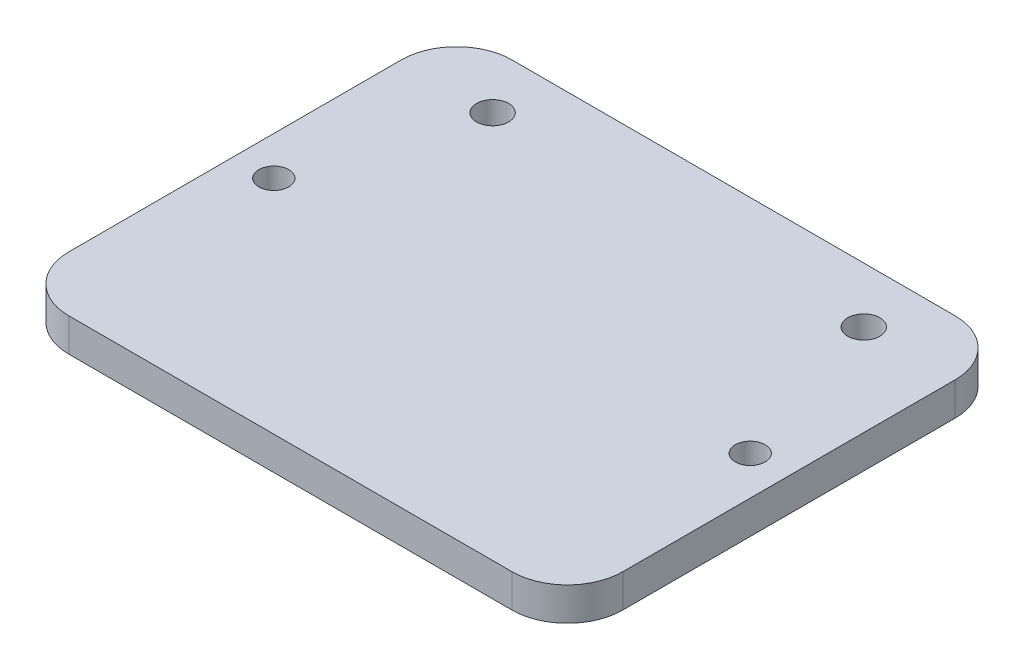
ISO-10303-21;
HEADER;
FILE_DESCRIPTION(('STEP AP214'),'2;1');
FILE_NAME('part.step','',(''),(''),'','','');
FILE_SCHEMA(('AUTOMOTIVE_DESIGN { 1 0 10303 214 1 1 1 1 }'));
ENDSEC;
DATA;
#1=APPLICATION_CONTEXT('core data for automotive mechanical design processes');
#2=APPLICATION_PROTOCOL_DEFINITION('international standard','automotive_design',2000,#1);
#3=PRODUCT_CONTEXT('',#1,'mechanical');
#4=PRODUCT('Part','Part','',(#3));
#5=PRODUCT_RELATED_PRODUCT_CATEGORY('part','',(#4));
#6=PRODUCT_DEFINITION_FORMATION('','',#4);
#7=PRODUCT_DEFINITION_CONTEXT('part definition',#1,'design');
#8=PRODUCT_DEFINITION('design','',#6,#7);
#9=PRODUCT_DEFINITION_SHAPE('','',#8);
#10=(LENGTH_UNIT() NAMED_UNIT(*) SI_UNIT(.MILLI.,.METRE.));
#11=(NAMED_UNIT(*) PLANE_ANGLE_UNIT() SI_UNIT($,.RADIAN.));
#12=(NAMED_UNIT(*) SI_UNIT($,.STERADIAN.) SOLID_ANGLE_UNIT());
#13=UNCERTAINTY_MEASURE_WITH_UNIT(LENGTH_MEASURE(1.E-05),#10,'distance_accuracy_value','');
#14=(GEOMETRIC_REPRESENTATION_CONTEXT(3) GLOBAL_UNCERTAINTY_ASSIGNED_CONTEXT((#13)) GLOBAL_UNIT_ASSIGNED_CONTEXT((#10,
#11,#12)) REPRESENTATION_CONTEXT('',''));
#15=CARTESIAN_POINT('',(0.,0.,0.));
#16=DIRECTION('',(0.,0.,1.));
#17=DIRECTION('',(1.,0.,0.));
#18=AXIS2_PLACEMENT_3D('',#15,#16,#17);
#19=CARTESIAN_POINT('',(0.,3.,-40.));
#20=DIRECTION('',(1.,0.,0.));
#21=DIRECTION('',(0.,0.,-1.));
#22=AXIS2_PLACEMENT_3D('',#19,#20,#21);
#23=PLANE('',#22);
#24=DIRECTION('',(0.,0.,1.));
#25=VECTOR('',#24,1.);
#26=CARTESIAN_POINT('',(0.,0.,-40.));
#27=LINE('',#26,#25);
#28=CARTESIAN_POINT('',(0.,0.,-35.));
#29=VERTEX_POINT('',#28);
#30=CARTESIAN_POINT('',(0.,0.,-5.));
#31=VERTEX_POINT('',#30);
#32=EDGE_CURVE('E131',#29,#31,#27,.T.);
#33=ORIENTED_EDGE('',*,*,#32,.T.);
#34=DIRECTION('',(0.,-1.,0.));
#35=VECTOR('',#34,1.);
#36=CARTESIAN_POINT('',(0.,3.,-5.));
#37=LINE('',#36,#35);
#38=CARTESIAN_POINT('',(0.,3.,-5.));
#39=VERTEX_POINT('',#38);
#40=EDGE_CURVE('E108',#31,#39,#37,.F.);
#41=ORIENTED_EDGE('',*,*,#40,.T.);
#42=DIRECTION('',(0.,0.,1.));
#43=VECTOR('',#42,1.);
#44=CARTESIAN_POINT('',(0.,3.,-40.));
#45=LINE('',#44,#43);
#46=CARTESIAN_POINT('',(0.,3.,-35.));
#47=VERTEX_POINT('',#46);
#48=EDGE_CURVE('E141',#47,#39,#45,.T.);
#49=ORIENTED_EDGE('',*,*,#48,.F.);
#50=DIRECTION('',(0.,-1.,0.));
#51=VECTOR('',#50,1.);
#52=CARTESIAN_POINT('',(0.,3.,-35.));
#53=LINE('',#52,#51);
#54=EDGE_CURVE('E113',#47,#29,#53,.T.);
#55=ORIENTED_EDGE('',*,*,#54,.T.);
#56=EDGE_LOOP('',(#33,#41,#49,#55));
#57=FACE_BOUND('',#56,.T.);
#58=ADVANCED_FACE('F37',(#57),#23,.F.);
#59=CARTESIAN_POINT('',(0.,3.,0.));
#60=DIRECTION('',(0.,0.,-1.));
#61=DIRECTION('',(-1.,0.,0.));
#62=AXIS2_PLACEMENT_3D('',#59,#60,#61);
#63=PLANE('',#62);
#64=DIRECTION('',(1.,0.,0.));
#65=VECTOR('',#64,1.);
#66=CARTESIAN_POINT('',(0.,3.,0.));
#67=LINE('',#66,#65);
#68=CARTESIAN_POINT('',(5.,3.,0.));
#69=VERTEX_POINT('',#68);
#70=CARTESIAN_POINT('',(45.,3.,0.));
#71=VERTEX_POINT('',#70);
#72=EDGE_CURVE('E123',#69,#71,#67,.T.);
#73=ORIENTED_EDGE('',*,*,#72,.F.);
#74=DIRECTION('',(0.,-1.,0.));
#75=VECTOR('',#74,1.);
#76=CARTESIAN_POINT('',(5.,3.,0.));
#77=LINE('',#76,#75);
#78=CARTESIAN_POINT('',(5.,0.,0.));
#79=VERTEX_POINT('',#78);
#80=EDGE_CURVE('E107',#69,#79,#77,.T.);
#81=ORIENTED_EDGE('',*,*,#80,.T.);
#82=DIRECTION('',(1.,0.,0.));
#83=VECTOR('',#82,1.);
#84=CARTESIAN_POINT('',(0.,0.,0.));
#85=LINE('',#84,#83);
#86=CARTESIAN_POINT('',(45.,0.,0.));
#87=VERTEX_POINT('',#86);
#88=EDGE_CURVE('E120',#79,#87,#85,.T.);
#89=ORIENTED_EDGE('',*,*,#88,.T.);
#90=DIRECTION('',(0.,-1.,0.));
#91=VECTOR('',#90,1.);
#92=CARTESIAN_POINT('',(45.,3.,0.));
#93=LINE('',#92,#91);
#94=EDGE_CURVE('E125',#87,#71,#93,.F.);
#95=ORIENTED_EDGE('',*,*,#94,.T.);
#96=EDGE_LOOP('',(#73,#81,#89,#95));
#97=FACE_BOUND('',#96,.T.);
#98=ADVANCED_FACE('F119',(#97),#63,.F.);
#99=CARTESIAN_POINT('',(50.,3.,-40.));
#100=DIRECTION('',(-1.,0.,0.));
#101=DIRECTION('',(0.,0.,1.));
#102=AXIS2_PLACEMENT_3D('',#99,#100,#101);
#103=PLANE('',#102);
#104=DIRECTION('',(0.,0.,-1.));
#105=VECTOR('',#104,1.);
#106=CARTESIAN_POINT('',(50.,0.,-40.));
#107=LINE('',#106,#105);
#108=CARTESIAN_POINT('',(50.,0.,-5.));
#109=VERTEX_POINT('',#108);
#110=CARTESIAN_POINT('',(50.,0.,-35.));
#111=VERTEX_POINT('',#110);
#112=EDGE_CURVE('E130',#109,#111,#107,.T.);
#113=ORIENTED_EDGE('',*,*,#112,.T.);
#114=DIRECTION('',(0.,-1.,0.));
#115=VECTOR('',#114,1.);
#116=CARTESIAN_POINT('',(50.,3.,-35.));
#117=LINE('',#116,#115);
#118=CARTESIAN_POINT('',(50.,3.,-35.));
#119=VERTEX_POINT('',#118);
#120=EDGE_CURVE('E11',#111,#119,#117,.F.);
#121=ORIENTED_EDGE('',*,*,#120,.T.);
#122=DIRECTION('',(0.,0.,-1.));
#123=VECTOR('',#122,1.);
#124=CARTESIAN_POINT('',(50.,3.,-40.));
#125=LINE('',#124,#123);
#126=CARTESIAN_POINT('',(50.,3.,-5.));
#127=VERTEX_POINT('',#126);
#128=EDGE_CURVE('E179',#127,#119,#125,.T.);
#129=ORIENTED_EDGE('',*,*,#128,.F.);
#130=DIRECTION('',(0.,-1.,0.));
#131=VECTOR('',#130,1.);
#132=CARTESIAN_POINT('',(50.,3.,-5.));
#133=LINE('',#132,#131);
#134=EDGE_CURVE('E45',#127,#109,#133,.T.);
#135=ORIENTED_EDGE('',*,*,#134,.T.);
#136=EDGE_LOOP('',(#113,#121,#129,#135));
#137=FACE_BOUND('',#136,.T.);
#138=ADVANCED_FACE('F177',(#137),#103,.F.);
#139=CARTESIAN_POINT('',(0.,3.,-40.));
#140=DIRECTION('',(0.,0.,1.));
#141=DIRECTION('',(1.,0.,0.));
#142=AXIS2_PLACEMENT_3D('',#139,#140,#141);
#143=PLANE('',#142);
#144=DIRECTION('',(-1.,0.,0.));
#145=VECTOR('',#144,1.);
#146=CARTESIAN_POINT('',(0.,3.,-40.));
#147=LINE('',#146,#145);
#148=CARTESIAN_POINT('',(45.,3.,-40.));
#149=VERTEX_POINT('',#148);
#150=CARTESIAN_POINT('',(5.00000000000001,3.,-40.));
#151=VERTEX_POINT('',#150);
#152=EDGE_CURVE('E155',#149,#151,#147,.T.);
#153=ORIENTED_EDGE('',*,*,#152,.F.);
#154=DIRECTION('',(0.,-1.,0.));
#155=VECTOR('',#154,1.);
#156=CARTESIAN_POINT('',(45.,3.,-40.));
#157=LINE('',#156,#155);
#158=CARTESIAN_POINT('',(45.,0.,-40.));
#159=VERTEX_POINT('',#158);
#160=EDGE_CURVE('E171',#149,#159,#157,.T.);
#161=ORIENTED_EDGE('',*,*,#160,.T.);
#162=DIRECTION('',(-1.,0.,0.));
#163=VECTOR('',#162,1.);
#164=CARTESIAN_POINT('',(0.,0.,-40.));
#165=LINE('',#164,#163);
#166=CARTESIAN_POINT('',(5.00000000000001,0.,-40.));
#167=VERTEX_POINT('',#166);
#168=EDGE_CURVE('E134',#159,#167,#165,.T.);
#169=ORIENTED_EDGE('',*,*,#168,.T.);
#170=DIRECTION('',(0.,-1.,0.));
#171=VECTOR('',#170,1.);
#172=CARTESIAN_POINT('',(5.00000000000001,3.,-40.));
#173=LINE('',#172,#171);
#174=EDGE_CURVE('E52',#167,#151,#173,.F.);
#175=ORIENTED_EDGE('',*,*,#174,.T.);
#176=EDGE_LOOP('',(#153,#161,#169,#175));
#177=FACE_BOUND('',#176,.T.);
#178=ADVANCED_FACE('F186',(#177),#143,.F.);
#179=CARTESIAN_POINT('',(0.,3.,0.));
#180=DIRECTION('',(0.,1.,0.));
#181=DIRECTION('',(0.,0.,1.));
#182=AXIS2_PLACEMENT_3D('',#179,#180,#181);
#183=PLANE('',#182);
#184=CARTESIAN_POINT('',(3.5,3.,-20.));
#185=DIRECTION('',(0.,1.,0.));
#186=DIRECTION('',(0.,0.,1.));
#187=AXIS2_PLACEMENT_3D('',#184,#185,#186);
#188=CIRCLE('',#187,1.35);
#189=CARTESIAN_POINT('',(3.5,3.,-18.65));
#190=VERTEX_POINT('',#189);
#191=EDGE_CURVE('E154',#190,#190,#188,.T.);
#192=ORIENTED_EDGE('',*,*,#191,.F.);
#193=EDGE_LOOP('',(#192));
#194=FACE_BOUND('',#193,.T.);
#195=CARTESIAN_POINT('',(46.5,3.,-20.));
#196=DIRECTION('',(0.,1.,0.));
#197=DIRECTION('',(0.,0.,1.));
#198=AXIS2_PLACEMENT_3D('',#195,#196,#197);
#199=CIRCLE('',#198,1.35);
#200=CARTESIAN_POINT('',(46.5,3.,-18.65));
#201=VERTEX_POINT('',#200);
#202=EDGE_CURVE('E150',#201,#201,#199,.T.);
#203=ORIENTED_EDGE('',*,*,#202,.F.);
#204=EDGE_LOOP('',(#203));
#205=FACE_BOUND('',#204,.T.);
#206=CARTESIAN_POINT('',(8.25,3.,-35.));
#207=DIRECTION('',(0.,1.,0.));
#208=DIRECTION('',(0.,0.,1.));
#209=AXIS2_PLACEMENT_3D('',#206,#207,#208);
#210=CIRCLE('',#209,1.45);
#211=CARTESIAN_POINT('',(8.25,3.,-33.55));
#212=VERTEX_POINT('',#211);
#213=EDGE_CURVE('E146',#212,#212,#210,.T.);
#214=ORIENTED_EDGE('',*,*,#213,.F.);
#215=EDGE_LOOP('',(#214));
#216=FACE_BOUND('',#215,.T.);
#217=CARTESIAN_POINT('',(41.75,3.,-35.));
#218=DIRECTION('',(0.,1.,0.));
#219=DIRECTION('',(0.,0.,1.));
#220=AXIS2_PLACEMENT_3D('',#217,#218,#219);
#221=CIRCLE('',#220,1.45);
#222=CARTESIAN_POINT('',(41.75,3.,-33.55));
#223=VERTEX_POINT('',#222);
#224=EDGE_CURVE('E145',#223,#223,#221,.T.);
#225=ORIENTED_EDGE('',*,*,#224,.F.);
#226=EDGE_LOOP('',(#225));
#227=FACE_BOUND('',#226,.T.);
#228=ORIENTED_EDGE('',*,*,#48,.T.);
#229=CARTESIAN_POINT('',(5.,3.,-5.));
#230=DIRECTION('',(0.,1.,0.));
#231=DIRECTION('',(0.,0.,1.));
#232=AXIS2_PLACEMENT_3D('',#229,#230,#231);
#233=CIRCLE('',#232,5.);
#234=EDGE_CURVE('E168',#39,#69,#233,.T.);
#235=ORIENTED_EDGE('',*,*,#234,.T.);
#236=ORIENTED_EDGE('',*,*,#72,.T.);
#237=CARTESIAN_POINT('',(45.,3.,-5.));
#238=DIRECTION('',(0.,1.,0.));
#239=DIRECTION('',(0.,0.,1.));
#240=AXIS2_PLACEMENT_3D('',#237,#238,#239);
#241=CIRCLE('',#240,5.);
#242=EDGE_CURVE('E165',#71,#127,#241,.T.);
#243=ORIENTED_EDGE('',*,*,#242,.T.);
#244=ORIENTED_EDGE('',*,*,#128,.T.);
#245=CARTESIAN_POINT('',(45.,3.,-35.));
#246=DIRECTION('',(0.,1.,0.));
#247=DIRECTION('',(0.,0.,1.));
#248=AXIS2_PLACEMENT_3D('',#245,#246,#247);
#249=CIRCLE('',#248,5.);
#250=EDGE_CURVE('E59',#119,#149,#249,.T.);
#251=ORIENTED_EDGE('',*,*,#250,.T.);
#252=ORIENTED_EDGE('',*,*,#152,.T.);
#253=CARTESIAN_POINT('',(5.00000000000001,3.,-35.));
#254=DIRECTION('',(0.,1.,0.));
#255=DIRECTION('',(0.,0.,1.));
#256=AXIS2_PLACEMENT_3D('',#253,#254,#255);
#257=CIRCLE('',#256,5.);
#258=EDGE_CURVE('E163',#151,#47,#257,.T.);
#259=ORIENTED_EDGE('',*,*,#258,.T.);
#260=EDGE_LOOP('',(#228,#235,#236,#243,#244,#251,#252,#259));
#261=FACE_BOUND('',#260,.T.);
#262=ADVANCED_FACE('F207',(#194,#205,#216,#227,#261),#183,.T.);
#263=CARTESIAN_POINT('',(0.,0.,0.));
#264=DIRECTION('',(0.,1.,0.));
#265=DIRECTION('',(0.,0.,1.));
#266=AXIS2_PLACEMENT_3D('',#263,#264,#265);
#267=PLANE('',#266);
#268=CARTESIAN_POINT('',(3.5,0.,-20.));
#269=DIRECTION('',(0.,1.,0.));
#270=DIRECTION('',(0.,0.,1.));
#271=AXIS2_PLACEMENT_3D('',#268,#269,#270);
#272=CIRCLE('',#271,1.35);
#273=CARTESIAN_POINT('',(3.5,0.,-18.65));
#274=VERTEX_POINT('',#273);
#275=EDGE_CURVE('E151',#274,#274,#272,.T.);
#276=ORIENTED_EDGE('',*,*,#275,.T.);
#277=EDGE_LOOP('',(#276));
#278=FACE_BOUND('',#277,.T.);
#279=CARTESIAN_POINT('',(46.5,0.,-20.));
#280=DIRECTION('',(0.,1.,0.));
#281=DIRECTION('',(0.,0.,1.));
#282=AXIS2_PLACEMENT_3D('',#279,#280,#281);
#283=CIRCLE('',#282,1.35);
#284=CARTESIAN_POINT('',(46.5,0.,-18.65));
#285=VERTEX_POINT('',#284);
#286=EDGE_CURVE('E147',#285,#285,#283,.T.);
#287=ORIENTED_EDGE('',*,*,#286,.T.);
#288=EDGE_LOOP('',(#287));
#289=FACE_BOUND('',#288,.T.);
#290=CARTESIAN_POINT('',(8.25,0.,-35.));
#291=DIRECTION('',(0.,1.,0.));
#292=DIRECTION('',(0.,0.,1.));
#293=AXIS2_PLACEMENT_3D('',#290,#291,#292);
#294=CIRCLE('',#293,1.45);
#295=CARTESIAN_POINT('',(8.25,0.,-33.55));
#296=VERTEX_POINT('',#295);
#297=EDGE_CURVE('E142',#296,#296,#294,.T.);
#298=ORIENTED_EDGE('',*,*,#297,.T.);
#299=EDGE_LOOP('',(#298));
#300=FACE_BOUND('',#299,.T.);
#301=CARTESIAN_POINT('',(41.75,0.,-35.));
#302=DIRECTION('',(0.,1.,0.));
#303=DIRECTION('',(0.,0.,1.));
#304=AXIS2_PLACEMENT_3D('',#301,#302,#303);
#305=CIRCLE('',#304,1.45);
#306=CARTESIAN_POINT('',(41.75,0.,-33.55));
#307=VERTEX_POINT('',#306);
#308=EDGE_CURVE('E136',#307,#307,#305,.T.);
#309=ORIENTED_EDGE('',*,*,#308,.T.);
#310=EDGE_LOOP('',(#309));
#311=FACE_BOUND('',#310,.T.);
#312=ORIENTED_EDGE('',*,*,#88,.F.);
#313=CARTESIAN_POINT('',(5.,0.,-5.));
#314=DIRECTION('',(0.,1.,0.));
#315=DIRECTION('',(0.,0.,1.));
#316=AXIS2_PLACEMENT_3D('',#313,#314,#315);
#317=CIRCLE('',#316,5.);
#318=EDGE_CURVE('E103',#79,#31,#317,.F.);
#319=ORIENTED_EDGE('',*,*,#318,.T.);
#320=ORIENTED_EDGE('',*,*,#32,.F.);
#321=CARTESIAN_POINT('',(5.00000000000001,0.,-35.));
#322=DIRECTION('',(0.,1.,0.));
#323=DIRECTION('',(0.,0.,1.));
#324=AXIS2_PLACEMENT_3D('',#321,#322,#323);
#325=CIRCLE('',#324,5.);
#326=EDGE_CURVE('E124',#29,#167,#325,.F.);
#327=ORIENTED_EDGE('',*,*,#326,.T.);
#328=ORIENTED_EDGE('',*,*,#168,.F.);
#329=CARTESIAN_POINT('',(45.,0.,-35.));
#330=DIRECTION('',(0.,1.,0.));
#331=DIRECTION('',(0.,0.,1.));
#332=AXIS2_PLACEMENT_3D('',#329,#330,#331);
#333=CIRCLE('',#332,5.);
#334=EDGE_CURVE('E114',#159,#111,#333,.F.);
#335=ORIENTED_EDGE('',*,*,#334,.T.);
#336=ORIENTED_EDGE('',*,*,#112,.F.);
#337=CARTESIAN_POINT('',(45.,0.,-5.));
#338=DIRECTION('',(0.,1.,0.));
#339=DIRECTION('',(0.,0.,1.));
#340=AXIS2_PLACEMENT_3D('',#337,#338,#339);
#341=CIRCLE('',#340,5.);
#342=EDGE_CURVE('E129',#109,#87,#341,.F.);
#343=ORIENTED_EDGE('',*,*,#342,.T.);
#344=EDGE_LOOP('',(#312,#319,#320,#327,#328,#335,#336,#343));
#345=FACE_BOUND('',#344,.T.);
#346=ADVANCED_FACE('F127',(#278,#289,#300,#311,#345),#267,.F.);
#347=CARTESIAN_POINT('',(41.75,3.,-35.));
#348=DIRECTION('',(0.,1.,0.));
#349=DIRECTION('',(0.,0.,1.));
#350=AXIS2_PLACEMENT_3D('',#347,#348,#349);
#351=CYLINDRICAL_SURFACE('',#350,1.45);
#352=ORIENTED_EDGE('',*,*,#224,.T.);
#353=EDGE_LOOP('',(#352));
#354=FACE_BOUND('',#353,.T.);
#355=ORIENTED_EDGE('',*,*,#308,.F.);
#356=EDGE_LOOP('',(#355));
#357=FACE_BOUND('',#356,.T.);
#358=ADVANCED_FACE('F282',(#354,#357),#351,.F.);
#359=CARTESIAN_POINT('',(8.25,3.,-35.));
#360=DIRECTION('',(0.,1.,0.));
#361=DIRECTION('',(0.,0.,1.));
#362=AXIS2_PLACEMENT_3D('',#359,#360,#361);
#363=CYLINDRICAL_SURFACE('',#362,1.45);
#364=ORIENTED_EDGE('',*,*,#213,.T.);
#365=EDGE_LOOP('',(#364));
#366=FACE_BOUND('',#365,.T.);
#367=ORIENTED_EDGE('',*,*,#297,.F.);
#368=EDGE_LOOP('',(#367));
#369=FACE_BOUND('',#368,.T.);
#370=ADVANCED_FACE('F273',(#366,#369),#363,.F.);
#371=CARTESIAN_POINT('',(46.5,3.,-20.));
#372=DIRECTION('',(0.,1.,0.));
#373=DIRECTION('',(0.,0.,1.));
#374=AXIS2_PLACEMENT_3D('',#371,#372,#373);
#375=CYLINDRICAL_SURFACE('',#374,1.35);
#376=ORIENTED_EDGE('',*,*,#202,.T.);
#377=EDGE_LOOP('',(#376));
#378=FACE_BOUND('',#377,.T.);
#379=ORIENTED_EDGE('',*,*,#286,.F.);
#380=EDGE_LOOP('',(#379));
#381=FACE_BOUND('',#380,.T.);
#382=ADVANCED_FACE('F265',(#378,#381),#375,.F.);
#383=CARTESIAN_POINT('',(3.5,3.,-20.));
#384=DIRECTION('',(0.,1.,0.));
#385=DIRECTION('',(0.,0.,1.));
#386=AXIS2_PLACEMENT_3D('',#383,#384,#385);
#387=CYLINDRICAL_SURFACE('',#386,1.35);
#388=ORIENTED_EDGE('',*,*,#191,.T.);
#389=EDGE_LOOP('',(#388));
#390=FACE_BOUND('',#389,.T.);
#391=ORIENTED_EDGE('',*,*,#275,.F.);
#392=EDGE_LOOP('',(#391));
#393=FACE_BOUND('',#392,.T.);
#394=ADVANCED_FACE('F204',(#390,#393),#387,.F.);
#395=CARTESIAN_POINT('',(5.,3.,-5.));
#396=DIRECTION('',(0.,-1.,0.));
#397=DIRECTION('',(0.,0.,-1.));
#398=AXIS2_PLACEMENT_3D('',#395,#396,#397);
#399=CYLINDRICAL_SURFACE('',#398,5.);
#400=ORIENTED_EDGE('',*,*,#234,.F.);
#401=ORIENTED_EDGE('',*,*,#40,.F.);
#402=ORIENTED_EDGE('',*,*,#318,.F.);
#403=ORIENTED_EDGE('',*,*,#80,.F.);
#404=EDGE_LOOP('',(#400,#401,#402,#403));
#405=FACE_BOUND('',#404,.T.);
#406=ADVANCED_FACE('F106',(#405),#399,.T.);
#407=CARTESIAN_POINT('',(45.,3.,-35.));
#408=DIRECTION('',(0.,-1.,0.));
#409=DIRECTION('',(0.,0.,-1.));
#410=AXIS2_PLACEMENT_3D('',#407,#408,#409);
#411=CYLINDRICAL_SURFACE('',#410,5.);
#412=ORIENTED_EDGE('',*,*,#250,.F.);
#413=ORIENTED_EDGE('',*,*,#120,.F.);
#414=ORIENTED_EDGE('',*,*,#334,.F.);
#415=ORIENTED_EDGE('',*,*,#160,.F.);
#416=EDGE_LOOP('',(#412,#413,#414,#415));
#417=FACE_BOUND('',#416,.T.);
#418=ADVANCED_FACE('F185',(#417),#411,.T.);
#419=CARTESIAN_POINT('',(45.,3.,-5.));
#420=DIRECTION('',(0.,-1.,0.));
#421=DIRECTION('',(0.,0.,-1.));
#422=AXIS2_PLACEMENT_3D('',#419,#420,#421);
#423=CYLINDRICAL_SURFACE('',#422,5.);
#424=ORIENTED_EDGE('',*,*,#242,.F.);
#425=ORIENTED_EDGE('',*,*,#94,.F.);
#426=ORIENTED_EDGE('',*,*,#342,.F.);
#427=ORIENTED_EDGE('',*,*,#134,.F.);
#428=EDGE_LOOP('',(#424,#425,#426,#427));
#429=FACE_BOUND('',#428,.T.);
#430=ADVANCED_FACE('F221',(#429),#423,.T.);
#431=CARTESIAN_POINT('',(5.00000000000001,3.,-35.));
#432=DIRECTION('',(0.,-1.,0.));
#433=DIRECTION('',(0.,0.,-1.));
#434=AXIS2_PLACEMENT_3D('',#431,#432,#433);
#435=CYLINDRICAL_SURFACE('',#434,5.);
#436=ORIENTED_EDGE('',*,*,#258,.F.);
#437=ORIENTED_EDGE('',*,*,#174,.F.);
#438=ORIENTED_EDGE('',*,*,#326,.F.);
#439=ORIENTED_EDGE('',*,*,#54,.F.);
#440=EDGE_LOOP('',(#436,#437,#438,#439));
#441=FACE_BOUND('',#440,.T.);
#442=ADVANCED_FACE('F39',(#441),#435,.T.);
#443=CLOSED_SHELL('',(#58,#98,#138,#178,#262,#346,#358,#370,#382,#394,#406,#418,#430,#442));
#444=MANIFOLD_SOLID_BREP('B2',#443);
#445=ADVANCED_BREP_SHAPE_REPRESENTATION('',(#18,#444),#14);
#446=SHAPE_DEFINITION_REPRESENTATION(#9,#445);
ENDSEC;
END-ISO-10303-21;
